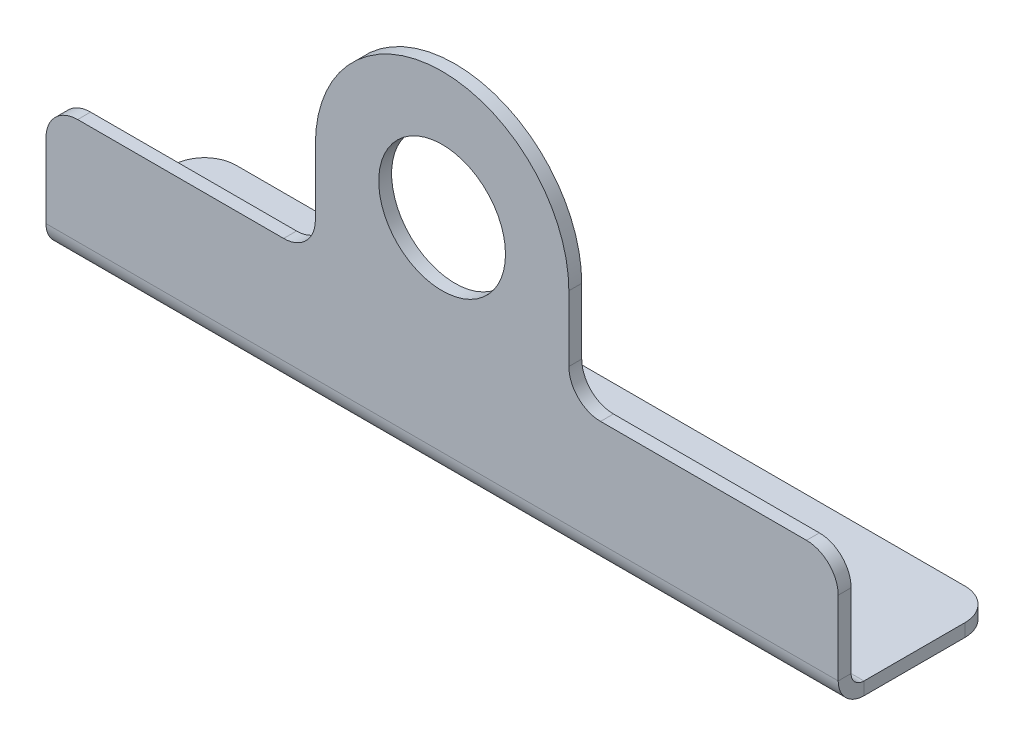
ISO-10303-21;
HEADER;
FILE_DESCRIPTION(('STEP AP214'),'2;1');
FILE_NAME('part.step','',(''),(''),'','','');
FILE_SCHEMA(('AUTOMOTIVE_DESIGN { 1 0 10303 214 1 1 1 1 }'));
ENDSEC;
DATA;
#1=APPLICATION_CONTEXT('core data for automotive mechanical design processes');
#2=APPLICATION_PROTOCOL_DEFINITION('international standard','automotive_design',2000,#1);
#3=PRODUCT_CONTEXT('',#1,'mechanical');
#4=PRODUCT('Part','Part','',(#3));
#5=PRODUCT_RELATED_PRODUCT_CATEGORY('part','',(#4));
#6=PRODUCT_DEFINITION_FORMATION('','',#4);
#7=PRODUCT_DEFINITION_CONTEXT('part definition',#1,'design');
#8=PRODUCT_DEFINITION('design','',#6,#7);
#9=PRODUCT_DEFINITION_SHAPE('','',#8);
#10=(LENGTH_UNIT() NAMED_UNIT(*) SI_UNIT(.MILLI.,.METRE.));
#11=(NAMED_UNIT(*) PLANE_ANGLE_UNIT() SI_UNIT($,.RADIAN.));
#12=(NAMED_UNIT(*) SI_UNIT($,.STERADIAN.) SOLID_ANGLE_UNIT());
#13=UNCERTAINTY_MEASURE_WITH_UNIT(LENGTH_MEASURE(1.E-05),#10,'distance_accuracy_value','');
#14=(GEOMETRIC_REPRESENTATION_CONTEXT(3) GLOBAL_UNCERTAINTY_ASSIGNED_CONTEXT((#13)) GLOBAL_UNIT_ASSIGNED_CONTEXT((#10,
#11,#12)) REPRESENTATION_CONTEXT('',''));
#15=CARTESIAN_POINT('',(0.,0.,0.));
#16=DIRECTION('',(0.,0.,1.));
#17=DIRECTION('',(1.,0.,0.));
#18=AXIS2_PLACEMENT_3D('',#15,#16,#17);
#19=CARTESIAN_POINT('',(-25.,5.49999999999999,-0.8128));
#20=DIRECTION('',(-1.,0.,0.));
#21=DIRECTION('',(0.,0.,1.));
#22=AXIS2_PLACEMENT_3D('',#19,#20,#21);
#23=PLANE('',#22);
#24=DIRECTION('',(0.,-1.,0.));
#25=VECTOR('',#24,1.);
#26=CARTESIAN_POINT('',(-25.,5.49999999999999,-0.8128));
#27=LINE('',#26,#25);
#28=CARTESIAN_POINT('',(-25.,5.49999999999999,-0.8128));
#29=VERTEX_POINT('',#28);
#30=CARTESIAN_POINT('',(-25.,0.812799999999997,-0.812799999999998));
#31=VERTEX_POINT('',#30);
#32=EDGE_CURVE('E259',#29,#31,#27,.T.);
#33=ORIENTED_EDGE('',*,*,#32,.T.);
#34=DIRECTION('',(0.,0.,1.));
#35=VECTOR('',#34,1.);
#36=CARTESIAN_POINT('',(-25.,0.812799999999997,-0.812799999999998));
#37=LINE('',#36,#35);
#38=CARTESIAN_POINT('',(-25.,0.812799999999999,0.));
#39=VERTEX_POINT('',#38);
#40=EDGE_CURVE('E211',#31,#39,#37,.T.);
#41=ORIENTED_EDGE('',*,*,#40,.T.);
#42=DIRECTION('',(0.,-1.,0.));
#43=VECTOR('',#42,1.);
#44=CARTESIAN_POINT('',(-25.,5.49999999999999,0.));
#45=LINE('',#44,#43);
#46=CARTESIAN_POINT('',(-25.,5.49999999999999,0.));
#47=VERTEX_POINT('',#46);
#48=EDGE_CURVE('E232',#47,#39,#45,.T.);
#49=ORIENTED_EDGE('',*,*,#48,.F.);
#50=DIRECTION('',(0.,0.,1.));
#51=VECTOR('',#50,1.);
#52=CARTESIAN_POINT('',(-25.,5.49999999999999,-0.8128));
#53=LINE('',#52,#51);
#54=EDGE_CURVE('E293',#29,#47,#53,.T.);
#55=ORIENTED_EDGE('',*,*,#54,.F.);
#56=EDGE_LOOP('',(#33,#41,#49,#55));
#57=FACE_BOUND('',#56,.T.);
#58=ADVANCED_FACE('F41',(#57),#23,.T.);
#59=CARTESIAN_POINT('',(23.,5.49999999999999,-0.8128));
#60=DIRECTION('',(0.,0.,1.));
#61=DIRECTION('',(1.,0.,0.));
#62=AXIS2_PLACEMENT_3D('',#59,#60,#61);
#63=PLANE('',#62);
#64=CARTESIAN_POINT('',(0.,13.64,-0.8128));
#65=DIRECTION('',(0.,0.,1.));
#66=DIRECTION('',(1.,0.,0.));
#67=AXIS2_PLACEMENT_3D('',#64,#65,#66);
#68=CIRCLE('',#67,4.);
#69=CARTESIAN_POINT('',(4.,13.64,-0.8128));
#70=VERTEX_POINT('',#69);
#71=EDGE_CURVE('E223',#70,#70,#68,.T.);
#72=ORIENTED_EDGE('',*,*,#71,.T.);
#73=EDGE_LOOP('',(#72));
#74=FACE_BOUND('',#73,.T.);
#75=DIRECTION('',(-1.,0.,0.));
#76=VECTOR('',#75,1.);
#77=CARTESIAN_POINT('',(-25.,0.812799999999997,-0.812799999999998));
#78=LINE('',#77,#76);
#79=CARTESIAN_POINT('',(25.,0.812800000000001,-0.812799999999998));
#80=VERTEX_POINT('',#79);
#81=EDGE_CURVE('E215',#31,#80,#78,.F.);
#82=ORIENTED_EDGE('',*,*,#81,.F.);
#83=ORIENTED_EDGE('',*,*,#32,.F.);
#84=CARTESIAN_POINT('',(-23.,5.49999999999999,-0.8128));
#85=DIRECTION('',(0.,0.,1.));
#86=DIRECTION('',(1.,0.,0.));
#87=AXIS2_PLACEMENT_3D('',#84,#85,#86);
#88=CIRCLE('',#87,2.);
#89=CARTESIAN_POINT('',(-23.,7.5,-0.8128));
#90=VERTEX_POINT('',#89);
#91=EDGE_CURVE('E256',#90,#29,#88,.T.);
#92=ORIENTED_EDGE('',*,*,#91,.F.);
#93=DIRECTION('',(-1.,0.,0.));
#94=VECTOR('',#93,1.);
#95=CARTESIAN_POINT('',(-10.,7.5,-0.8128));
#96=LINE('',#95,#94);
#97=CARTESIAN_POINT('',(-10.,7.5,-0.8128));
#98=VERTEX_POINT('',#97);
#99=EDGE_CURVE('E253',#98,#90,#96,.T.);
#100=ORIENTED_EDGE('',*,*,#99,.F.);
#101=CARTESIAN_POINT('',(-10.,9.5,-0.8128));
#102=DIRECTION('',(0.,0.,-1.));
#103=DIRECTION('',(-1.,0.,0.));
#104=AXIS2_PLACEMENT_3D('',#101,#102,#103);
#105=CIRCLE('',#104,2.);
#106=CARTESIAN_POINT('',(-8.,9.5,-0.8128));
#107=VERTEX_POINT('',#106);
#108=EDGE_CURVE('E250',#107,#98,#105,.T.);
#109=ORIENTED_EDGE('',*,*,#108,.F.);
#110=DIRECTION('',(0.,-1.,0.));
#111=VECTOR('',#110,1.);
#112=CARTESIAN_POINT('',(-8.,13.64,-0.8128));
#113=LINE('',#112,#111);
#114=CARTESIAN_POINT('',(-8.,13.64,-0.8128));
#115=VERTEX_POINT('',#114);
#116=EDGE_CURVE('E247',#115,#107,#113,.T.);
#117=ORIENTED_EDGE('',*,*,#116,.F.);
#118=CARTESIAN_POINT('',(0.,13.64,-0.8128));
#119=DIRECTION('',(0.,0.,1.));
#120=DIRECTION('',(1.,0.,0.));
#121=AXIS2_PLACEMENT_3D('',#118,#119,#120);
#122=CIRCLE('',#121,8.);
#123=CARTESIAN_POINT('',(8.,13.64,-0.8128));
#124=VERTEX_POINT('',#123);
#125=EDGE_CURVE('E244',#124,#115,#122,.T.);
#126=ORIENTED_EDGE('',*,*,#125,.F.);
#127=DIRECTION('',(0.,1.,0.));
#128=VECTOR('',#127,1.);
#129=CARTESIAN_POINT('',(8.,9.5,-0.8128));
#130=LINE('',#129,#128);
#131=CARTESIAN_POINT('',(8.,9.5,-0.8128));
#132=VERTEX_POINT('',#131);
#133=EDGE_CURVE('E241',#132,#124,#130,.T.);
#134=ORIENTED_EDGE('',*,*,#133,.F.);
#135=CARTESIAN_POINT('',(10.,9.5,-0.8128));
#136=DIRECTION('',(0.,0.,-1.));
#137=DIRECTION('',(-1.,0.,0.));
#138=AXIS2_PLACEMENT_3D('',#135,#136,#137);
#139=CIRCLE('',#138,2.);
#140=CARTESIAN_POINT('',(10.,7.5,-0.8128));
#141=VERTEX_POINT('',#140);
#142=EDGE_CURVE('E238',#141,#132,#139,.T.);
#143=ORIENTED_EDGE('',*,*,#142,.F.);
#144=DIRECTION('',(-1.,0.,0.));
#145=VECTOR('',#144,1.);
#146=CARTESIAN_POINT('',(23.,7.49999999999999,-0.8128));
#147=LINE('',#146,#145);
#148=CARTESIAN_POINT('',(23.,7.49999999999999,-0.8128));
#149=VERTEX_POINT('',#148);
#150=EDGE_CURVE('E235',#149,#141,#147,.T.);
#151=ORIENTED_EDGE('',*,*,#150,.F.);
#152=CARTESIAN_POINT('',(23.,5.49999999999999,-0.8128));
#153=DIRECTION('',(0.,0.,1.));
#154=DIRECTION('',(1.,0.,0.));
#155=AXIS2_PLACEMENT_3D('',#152,#153,#154);
#156=CIRCLE('',#155,2.);
#157=CARTESIAN_POINT('',(25.,5.49999999999999,-0.8128));
#158=VERTEX_POINT('',#157);
#159=EDGE_CURVE('E231',#158,#149,#156,.T.);
#160=ORIENTED_EDGE('',*,*,#159,.F.);
#161=DIRECTION('',(0.,1.,0.));
#162=VECTOR('',#161,1.);
#163=CARTESIAN_POINT('',(25.,0.,-0.8128));
#164=LINE('',#163,#162);
#165=EDGE_CURVE('E229',#80,#158,#164,.T.);
#166=ORIENTED_EDGE('',*,*,#165,.F.);
#167=EDGE_LOOP('',(#82,#83,#92,#100,#109,#117,#126,#134,#143,#151,#160,#166));
#168=FACE_BOUND('',#167,.T.);
#169=ADVANCED_FACE('F378',(#74,#168),#63,.F.);
#170=CARTESIAN_POINT('',(23.,5.49999999999999,0.));
#171=DIRECTION('',(0.,0.,1.));
#172=DIRECTION('',(1.,0.,0.));
#173=AXIS2_PLACEMENT_3D('',#170,#171,#172);
#174=PLANE('',#173);
#175=CARTESIAN_POINT('',(0.,13.64,0.));
#176=DIRECTION('',(0.,0.,1.));
#177=DIRECTION('',(1.,0.,0.));
#178=AXIS2_PLACEMENT_3D('',#175,#176,#177);
#179=CIRCLE('',#178,4.);
#180=CARTESIAN_POINT('',(4.,13.64,0.));
#181=VERTEX_POINT('',#180);
#182=EDGE_CURVE('E221',#181,#181,#179,.T.);
#183=ORIENTED_EDGE('',*,*,#182,.F.);
#184=EDGE_LOOP('',(#183));
#185=FACE_BOUND('',#184,.T.);
#186=ORIENTED_EDGE('',*,*,#48,.T.);
#187=DIRECTION('',(-1.,0.,0.));
#188=VECTOR('',#187,1.);
#189=CARTESIAN_POINT('',(-25.,0.812799999999999,0.));
#190=LINE('',#189,#188);
#191=CARTESIAN_POINT('',(25.,0.812800000000001,0.));
#192=VERTEX_POINT('',#191);
#193=EDGE_CURVE('E175',#39,#192,#190,.F.);
#194=ORIENTED_EDGE('',*,*,#193,.T.);
#195=DIRECTION('',(0.,1.,0.));
#196=VECTOR('',#195,1.);
#197=CARTESIAN_POINT('',(25.,0.,0.));
#198=LINE('',#197,#196);
#199=CARTESIAN_POINT('',(25.,5.49999999999999,0.));
#200=VERTEX_POINT('',#199);
#201=EDGE_CURVE('E226',#192,#200,#198,.T.);
#202=ORIENTED_EDGE('',*,*,#201,.T.);
#203=CARTESIAN_POINT('',(23.,5.49999999999999,0.));
#204=DIRECTION('',(0.,0.,1.));
#205=DIRECTION('',(1.,0.,0.));
#206=AXIS2_PLACEMENT_3D('',#203,#204,#205);
#207=CIRCLE('',#206,2.);
#208=CARTESIAN_POINT('',(23.,7.49999999999999,0.));
#209=VERTEX_POINT('',#208);
#210=EDGE_CURVE('E264',#200,#209,#207,.T.);
#211=ORIENTED_EDGE('',*,*,#210,.T.);
#212=DIRECTION('',(-1.,0.,0.));
#213=VECTOR('',#212,1.);
#214=CARTESIAN_POINT('',(23.,7.49999999999999,0.));
#215=LINE('',#214,#213);
#216=CARTESIAN_POINT('',(10.,7.5,0.));
#217=VERTEX_POINT('',#216);
#218=EDGE_CURVE('E267',#209,#217,#215,.T.);
#219=ORIENTED_EDGE('',*,*,#218,.T.);
#220=CARTESIAN_POINT('',(10.,9.5,0.));
#221=DIRECTION('',(0.,0.,-1.));
#222=DIRECTION('',(-1.,0.,0.));
#223=AXIS2_PLACEMENT_3D('',#220,#221,#222);
#224=CIRCLE('',#223,2.);
#225=CARTESIAN_POINT('',(8.,9.5,0.));
#226=VERTEX_POINT('',#225);
#227=EDGE_CURVE('E270',#217,#226,#224,.T.);
#228=ORIENTED_EDGE('',*,*,#227,.T.);
#229=DIRECTION('',(0.,1.,0.));
#230=VECTOR('',#229,1.);
#231=CARTESIAN_POINT('',(8.,9.5,0.));
#232=LINE('',#231,#230);
#233=CARTESIAN_POINT('',(8.,13.64,0.));
#234=VERTEX_POINT('',#233);
#235=EDGE_CURVE('E273',#226,#234,#232,.T.);
#236=ORIENTED_EDGE('',*,*,#235,.T.);
#237=CARTESIAN_POINT('',(0.,13.64,0.));
#238=DIRECTION('',(0.,0.,1.));
#239=DIRECTION('',(1.,0.,0.));
#240=AXIS2_PLACEMENT_3D('',#237,#238,#239);
#241=CIRCLE('',#240,8.);
#242=CARTESIAN_POINT('',(-8.,13.64,0.));
#243=VERTEX_POINT('',#242);
#244=EDGE_CURVE('E276',#234,#243,#241,.T.);
#245=ORIENTED_EDGE('',*,*,#244,.T.);
#246=DIRECTION('',(0.,-1.,0.));
#247=VECTOR('',#246,1.);
#248=CARTESIAN_POINT('',(-8.,13.64,0.));
#249=LINE('',#248,#247);
#250=CARTESIAN_POINT('',(-8.,9.5,0.));
#251=VERTEX_POINT('',#250);
#252=EDGE_CURVE('E279',#243,#251,#249,.T.);
#253=ORIENTED_EDGE('',*,*,#252,.T.);
#254=CARTESIAN_POINT('',(-10.,9.5,0.));
#255=DIRECTION('',(0.,0.,-1.));
#256=DIRECTION('',(-1.,0.,0.));
#257=AXIS2_PLACEMENT_3D('',#254,#255,#256);
#258=CIRCLE('',#257,2.);
#259=CARTESIAN_POINT('',(-10.,7.5,0.));
#260=VERTEX_POINT('',#259);
#261=EDGE_CURVE('E282',#251,#260,#258,.T.);
#262=ORIENTED_EDGE('',*,*,#261,.T.);
#263=DIRECTION('',(-1.,0.,0.));
#264=VECTOR('',#263,1.);
#265=CARTESIAN_POINT('',(-10.,7.5,0.));
#266=LINE('',#265,#264);
#267=CARTESIAN_POINT('',(-23.,7.5,0.));
#268=VERTEX_POINT('',#267);
#269=EDGE_CURVE('E285',#260,#268,#266,.T.);
#270=ORIENTED_EDGE('',*,*,#269,.T.);
#271=CARTESIAN_POINT('',(-23.,5.49999999999999,0.));
#272=DIRECTION('',(0.,0.,1.));
#273=DIRECTION('',(1.,0.,0.));
#274=AXIS2_PLACEMENT_3D('',#271,#272,#273);
#275=CIRCLE('',#274,2.);
#276=EDGE_CURVE('E288',#268,#47,#275,.T.);
#277=ORIENTED_EDGE('',*,*,#276,.T.);
#278=EDGE_LOOP('',(#186,#194,#202,#211,#219,#228,#236,#245,#253,#262,#270,#277));
#279=FACE_BOUND('',#278,.T.);
#280=ADVANCED_FACE('F385',(#185,#279),#174,.T.);
#281=CARTESIAN_POINT('',(25.,0.,-0.8128));
#282=DIRECTION('',(1.,0.,0.));
#283=DIRECTION('',(0.,0.,-1.));
#284=AXIS2_PLACEMENT_3D('',#281,#282,#283);
#285=PLANE('',#284);
#286=DIRECTION('',(0.,0.,1.));
#287=VECTOR('',#286,1.);
#288=CARTESIAN_POINT('',(25.,0.812800000000001,-0.812799999999998));
#289=LINE('',#288,#287);
#290=EDGE_CURVE('E218',#80,#192,#289,.T.);
#291=ORIENTED_EDGE('',*,*,#290,.F.);
#292=ORIENTED_EDGE('',*,*,#165,.T.);
#293=DIRECTION('',(0.,0.,1.));
#294=VECTOR('',#293,1.);
#295=CARTESIAN_POINT('',(25.,5.49999999999999,-0.8128));
#296=LINE('',#295,#294);
#297=EDGE_CURVE('E262',#158,#200,#296,.T.);
#298=ORIENTED_EDGE('',*,*,#297,.T.);
#299=ORIENTED_EDGE('',*,*,#201,.F.);
#300=EDGE_LOOP('',(#291,#292,#298,#299));
#301=FACE_BOUND('',#300,.T.);
#302=ADVANCED_FACE('F394',(#301),#285,.T.);
#303=CARTESIAN_POINT('',(-23.,5.49999999999999,-0.8128));
#304=DIRECTION('',(0.,0.,1.));
#305=DIRECTION('',(1.,0.,0.));
#306=AXIS2_PLACEMENT_3D('',#303,#304,#305);
#307=CYLINDRICAL_SURFACE('',#306,2.);
#308=ORIENTED_EDGE('',*,*,#276,.F.);
#309=DIRECTION('',(0.,0.,1.));
#310=VECTOR('',#309,1.);
#311=CARTESIAN_POINT('',(-23.,7.5,-0.8128));
#312=LINE('',#311,#310);
#313=EDGE_CURVE('E296',#90,#268,#312,.T.);
#314=ORIENTED_EDGE('',*,*,#313,.F.);
#315=ORIENTED_EDGE('',*,*,#91,.T.);
#316=ORIENTED_EDGE('',*,*,#54,.T.);
#317=EDGE_LOOP('',(#308,#314,#315,#316));
#318=FACE_BOUND('',#317,.T.);
#319=ADVANCED_FACE('F390',(#318),#307,.T.);
#320=CARTESIAN_POINT('',(-10.,7.5,-0.8128));
#321=DIRECTION('',(0.,1.,0.));
#322=DIRECTION('',(-1.,0.,0.));
#323=AXIS2_PLACEMENT_3D('',#320,#321,#322);
#324=PLANE('',#323);
#325=ORIENTED_EDGE('',*,*,#269,.F.);
#326=DIRECTION('',(0.,0.,1.));
#327=VECTOR('',#326,1.);
#328=CARTESIAN_POINT('',(-10.,7.5,-0.8128));
#329=LINE('',#328,#327);
#330=EDGE_CURVE('E298',#98,#260,#329,.T.);
#331=ORIENTED_EDGE('',*,*,#330,.F.);
#332=ORIENTED_EDGE('',*,*,#99,.T.);
#333=ORIENTED_EDGE('',*,*,#313,.T.);
#334=EDGE_LOOP('',(#325,#331,#332,#333));
#335=FACE_BOUND('',#334,.T.);
#336=ADVANCED_FACE('F393',(#335),#324,.T.);
#337=CARTESIAN_POINT('',(-10.,9.5,-0.8128));
#338=DIRECTION('',(0.,0.,1.));
#339=DIRECTION('',(1.,0.,0.));
#340=AXIS2_PLACEMENT_3D('',#337,#338,#339);
#341=CYLINDRICAL_SURFACE('',#340,2.);
#342=ORIENTED_EDGE('',*,*,#261,.F.);
#343=DIRECTION('',(0.,0.,1.));
#344=VECTOR('',#343,1.);
#345=CARTESIAN_POINT('',(-8.,9.5,-0.8128));
#346=LINE('',#345,#344);
#347=EDGE_CURVE('E300',#107,#251,#346,.T.);
#348=ORIENTED_EDGE('',*,*,#347,.F.);
#349=ORIENTED_EDGE('',*,*,#108,.T.);
#350=ORIENTED_EDGE('',*,*,#330,.T.);
#351=EDGE_LOOP('',(#342,#348,#349,#350));
#352=FACE_BOUND('',#351,.T.);
#353=ADVANCED_FACE('F398',(#352),#341,.F.);
#354=CARTESIAN_POINT('',(-8.,13.64,-0.8128));
#355=DIRECTION('',(-1.,0.,0.));
#356=DIRECTION('',(0.,-1.,0.));
#357=AXIS2_PLACEMENT_3D('',#354,#355,#356);
#358=PLANE('',#357);
#359=ORIENTED_EDGE('',*,*,#252,.F.);
#360=DIRECTION('',(0.,0.,1.));
#361=VECTOR('',#360,1.);
#362=CARTESIAN_POINT('',(-8.,13.64,-0.8128));
#363=LINE('',#362,#361);
#364=EDGE_CURVE('E302',#115,#243,#363,.T.);
#365=ORIENTED_EDGE('',*,*,#364,.F.);
#366=ORIENTED_EDGE('',*,*,#116,.T.);
#367=ORIENTED_EDGE('',*,*,#347,.T.);
#368=EDGE_LOOP('',(#359,#365,#366,#367));
#369=FACE_BOUND('',#368,.T.);
#370=ADVANCED_FACE('F402',(#369),#358,.T.);
#371=CARTESIAN_POINT('',(0.,13.64,-0.8128));
#372=DIRECTION('',(0.,0.,1.));
#373=DIRECTION('',(1.,0.,0.));
#374=AXIS2_PLACEMENT_3D('',#371,#372,#373);
#375=CYLINDRICAL_SURFACE('',#374,8.);
#376=ORIENTED_EDGE('',*,*,#244,.F.);
#377=DIRECTION('',(0.,0.,1.));
#378=VECTOR('',#377,1.);
#379=CARTESIAN_POINT('',(8.,13.64,-0.8128));
#380=LINE('',#379,#378);
#381=EDGE_CURVE('E304',#124,#234,#380,.T.);
#382=ORIENTED_EDGE('',*,*,#381,.F.);
#383=ORIENTED_EDGE('',*,*,#125,.T.);
#384=ORIENTED_EDGE('',*,*,#364,.T.);
#385=EDGE_LOOP('',(#376,#382,#383,#384));
#386=FACE_BOUND('',#385,.T.);
#387=ADVANCED_FACE('F406',(#386),#375,.T.);
#388=CARTESIAN_POINT('',(8.,9.5,-0.8128));
#389=DIRECTION('',(1.,0.,0.));
#390=DIRECTION('',(0.,1.,0.));
#391=AXIS2_PLACEMENT_3D('',#388,#389,#390);
#392=PLANE('',#391);
#393=ORIENTED_EDGE('',*,*,#235,.F.);
#394=DIRECTION('',(0.,0.,1.));
#395=VECTOR('',#394,1.);
#396=CARTESIAN_POINT('',(8.,9.5,-0.8128));
#397=LINE('',#396,#395);
#398=EDGE_CURVE('E306',#132,#226,#397,.T.);
#399=ORIENTED_EDGE('',*,*,#398,.F.);
#400=ORIENTED_EDGE('',*,*,#133,.T.);
#401=ORIENTED_EDGE('',*,*,#381,.T.);
#402=EDGE_LOOP('',(#393,#399,#400,#401));
#403=FACE_BOUND('',#402,.T.);
#404=ADVANCED_FACE('F410',(#403),#392,.T.);
#405=CARTESIAN_POINT('',(10.,9.5,-0.8128));
#406=DIRECTION('',(0.,0.,1.));
#407=DIRECTION('',(1.,0.,0.));
#408=AXIS2_PLACEMENT_3D('',#405,#406,#407);
#409=CYLINDRICAL_SURFACE('',#408,2.);
#410=ORIENTED_EDGE('',*,*,#227,.F.);
#411=DIRECTION('',(0.,0.,1.));
#412=VECTOR('',#411,1.);
#413=CARTESIAN_POINT('',(10.,7.5,-0.8128));
#414=LINE('',#413,#412);
#415=EDGE_CURVE('E308',#141,#217,#414,.T.);
#416=ORIENTED_EDGE('',*,*,#415,.F.);
#417=ORIENTED_EDGE('',*,*,#142,.T.);
#418=ORIENTED_EDGE('',*,*,#398,.T.);
#419=EDGE_LOOP('',(#410,#416,#417,#418));
#420=FACE_BOUND('',#419,.T.);
#421=ADVANCED_FACE('F414',(#420),#409,.F.);
#422=CARTESIAN_POINT('',(23.,7.49999999999999,-0.8128));
#423=DIRECTION('',(0.,1.,0.));
#424=DIRECTION('',(-1.,0.,0.));
#425=AXIS2_PLACEMENT_3D('',#422,#423,#424);
#426=PLANE('',#425);
#427=ORIENTED_EDGE('',*,*,#218,.F.);
#428=DIRECTION('',(0.,0.,1.));
#429=VECTOR('',#428,1.);
#430=CARTESIAN_POINT('',(23.,7.49999999999999,-0.8128));
#431=LINE('',#430,#429);
#432=EDGE_CURVE('E310',#149,#209,#431,.T.);
#433=ORIENTED_EDGE('',*,*,#432,.F.);
#434=ORIENTED_EDGE('',*,*,#150,.T.);
#435=ORIENTED_EDGE('',*,*,#415,.T.);
#436=EDGE_LOOP('',(#427,#433,#434,#435));
#437=FACE_BOUND('',#436,.T.);
#438=ADVANCED_FACE('F418',(#437),#426,.T.);
#439=CARTESIAN_POINT('',(23.,5.49999999999999,-0.8128));
#440=DIRECTION('',(0.,0.,1.));
#441=DIRECTION('',(1.,0.,0.));
#442=AXIS2_PLACEMENT_3D('',#439,#440,#441);
#443=CYLINDRICAL_SURFACE('',#442,2.);
#444=ORIENTED_EDGE('',*,*,#210,.F.);
#445=ORIENTED_EDGE('',*,*,#297,.F.);
#446=ORIENTED_EDGE('',*,*,#159,.T.);
#447=ORIENTED_EDGE('',*,*,#432,.T.);
#448=EDGE_LOOP('',(#444,#445,#446,#447));
#449=FACE_BOUND('',#448,.T.);
#450=ADVANCED_FACE('F422',(#449),#443,.T.);
#451=CARTESIAN_POINT('',(0.,13.64,-0.8128));
#452=DIRECTION('',(0.,0.,1.));
#453=DIRECTION('',(1.,0.,0.));
#454=AXIS2_PLACEMENT_3D('',#451,#452,#453);
#455=CYLINDRICAL_SURFACE('',#454,4.);
#456=ORIENTED_EDGE('',*,*,#71,.F.);
#457=EDGE_LOOP('',(#456));
#458=FACE_BOUND('',#457,.T.);
#459=ORIENTED_EDGE('',*,*,#182,.T.);
#460=EDGE_LOOP('',(#459));
#461=FACE_BOUND('',#460,.T.);
#462=ADVANCED_FACE('F426',(#458,#461),#455,.F.);
#463=CARTESIAN_POINT('',(25.,0.812799999999999,-1.6256));
#464=DIRECTION('',(1.,0.,0.));
#465=DIRECTION('',(0.,1.,0.));
#466=AXIS2_PLACEMENT_3D('',#463,#464,#465);
#467=PLANE('',#466);
#468=DIRECTION('',(0.,-1.,0.));
#469=VECTOR('',#468,1.);
#470=CARTESIAN_POINT('',(25.,0.,-1.6256));
#471=LINE('',#470,#469);
#472=CARTESIAN_POINT('',(25.,0.,-1.6256));
#473=VERTEX_POINT('',#472);
#474=CARTESIAN_POINT('',(25.,-0.812800000000003,-1.62559999999999));
#475=VERTEX_POINT('',#474);
#476=EDGE_CURVE('E333',#473,#475,#471,.T.);
#477=ORIENTED_EDGE('',*,*,#476,.F.);
#478=CARTESIAN_POINT('',(25.,0.812799999999999,-1.6256));
#479=DIRECTION('',(-1.,0.,0.));
#480=DIRECTION('',(0.,-1.,0.));
#481=AXIS2_PLACEMENT_3D('',#478,#479,#480);
#482=CIRCLE('',#481,0.812800000000002);
#483=EDGE_CURVE('E178',#80,#473,#482,.F.);
#484=ORIENTED_EDGE('',*,*,#483,.F.);
#485=ORIENTED_EDGE('',*,*,#290,.T.);
#486=CARTESIAN_POINT('',(25.,0.812799999999999,-1.6256));
#487=DIRECTION('',(-1.,0.,0.));
#488=DIRECTION('',(0.,-1.,0.));
#489=AXIS2_PLACEMENT_3D('',#486,#487,#488);
#490=CIRCLE('',#489,1.6256);
#491=EDGE_CURVE('E210',#192,#475,#490,.F.);
#492=ORIENTED_EDGE('',*,*,#491,.T.);
#493=EDGE_LOOP('',(#477,#484,#485,#492));
#494=FACE_BOUND('',#493,.T.);
#495=ADVANCED_FACE('F447',(#494),#467,.T.);
#496=CARTESIAN_POINT('',(-25.,0.812799999999996,-1.6256));
#497=DIRECTION('',(1.,0.,0.));
#498=DIRECTION('',(0.,1.,0.));
#499=AXIS2_PLACEMENT_3D('',#496,#497,#498);
#500=PLANE('',#499);
#501=CARTESIAN_POINT('',(-25.,0.812799999999996,-1.6256));
#502=DIRECTION('',(-1.,0.,0.));
#503=DIRECTION('',(0.,-1.,0.));
#504=AXIS2_PLACEMENT_3D('',#501,#502,#503);
#505=CIRCLE('',#504,0.812800000000002);
#506=CARTESIAN_POINT('',(-25.,0.,-1.6256));
#507=VERTEX_POINT('',#506);
#508=EDGE_CURVE('E185',#507,#31,#505,.T.);
#509=ORIENTED_EDGE('',*,*,#508,.F.);
#510=DIRECTION('',(0.,-1.,0.));
#511=VECTOR('',#510,1.);
#512=CARTESIAN_POINT('',(-25.,0.,-1.6256));
#513=LINE('',#512,#511);
#514=CARTESIAN_POINT('',(-25.,-0.812800000000003,-1.62559999999999));
#515=VERTEX_POINT('',#514);
#516=EDGE_CURVE('E182',#507,#515,#513,.T.);
#517=ORIENTED_EDGE('',*,*,#516,.T.);
#518=CARTESIAN_POINT('',(-25.,0.812799999999996,-1.6256));
#519=DIRECTION('',(-1.,0.,0.));
#520=DIRECTION('',(0.,-1.,0.));
#521=AXIS2_PLACEMENT_3D('',#518,#519,#520);
#522=CIRCLE('',#521,1.6256);
#523=EDGE_CURVE('E168',#515,#39,#522,.T.);
#524=ORIENTED_EDGE('',*,*,#523,.T.);
#525=ORIENTED_EDGE('',*,*,#40,.F.);
#526=EDGE_LOOP('',(#509,#517,#524,#525));
#527=FACE_BOUND('',#526,.T.);
#528=ADVANCED_FACE('F183',(#527),#500,.F.);
#529=CARTESIAN_POINT('',(-25.,0.812799999999996,-1.6256));
#530=DIRECTION('',(-1.,0.,0.));
#531=DIRECTION('',(0.,-1.,0.));
#532=AXIS2_PLACEMENT_3D('',#529,#530,#531);
#533=CYLINDRICAL_SURFACE('',#532,1.6256);
#534=ORIENTED_EDGE('',*,*,#193,.F.);
#535=ORIENTED_EDGE('',*,*,#523,.F.);
#536=DIRECTION('',(1.,0.,0.));
#537=VECTOR('',#536,1.);
#538=CARTESIAN_POINT('',(0.,-0.812800000000003,-1.62559999999999));
#539=LINE('',#538,#537);
#540=EDGE_CURVE('E172',#515,#475,#539,.T.);
#541=ORIENTED_EDGE('',*,*,#540,.T.);
#542=ORIENTED_EDGE('',*,*,#491,.F.);
#543=EDGE_LOOP('',(#534,#535,#541,#542));
#544=FACE_BOUND('',#543,.T.);
#545=ADVANCED_FACE('F170',(#544),#533,.T.);
#546=CARTESIAN_POINT('',(-25.,0.812799999999996,-1.6256));
#547=DIRECTION('',(-1.,0.,0.));
#548=DIRECTION('',(0.,-1.,0.));
#549=AXIS2_PLACEMENT_3D('',#546,#547,#548);
#550=CYLINDRICAL_SURFACE('',#549,0.812800000000002);
#551=ORIENTED_EDGE('',*,*,#81,.T.);
#552=ORIENTED_EDGE('',*,*,#483,.T.);
#553=DIRECTION('',(-1.,0.,0.));
#554=VECTOR('',#553,1.);
#555=CARTESIAN_POINT('',(25.,0.,-1.6256));
#556=LINE('',#555,#554);
#557=EDGE_CURVE('E187',#473,#507,#556,.T.);
#558=ORIENTED_EDGE('',*,*,#557,.T.);
#559=ORIENTED_EDGE('',*,*,#508,.T.);
#560=EDGE_LOOP('',(#551,#552,#558,#559));
#561=FACE_BOUND('',#560,.T.);
#562=ADVANCED_FACE('F442',(#561),#550,.F.);
#563=CARTESIAN_POINT('',(-25.,-0.812800000000032,-10.));
#564=DIRECTION('',(1.,0.,0.));
#565=DIRECTION('',(0.,0.,-1.));
#566=AXIS2_PLACEMENT_3D('',#563,#564,#565);
#567=PLANE('',#566);
#568=DIRECTION('',(0.,0.,-1.));
#569=VECTOR('',#568,1.);
#570=CARTESIAN_POINT('',(-25.,0.,-10.));
#571=LINE('',#570,#569);
#572=CARTESIAN_POINT('',(-25.,0.,-8.));
#573=VERTEX_POINT('',#572);
#574=EDGE_CURVE('E195',#507,#573,#571,.T.);
#575=ORIENTED_EDGE('',*,*,#574,.T.);
#576=DIRECTION('',(0.,1.,0.));
#577=VECTOR('',#576,1.);
#578=CARTESIAN_POINT('',(-25.,-0.812800000000025,-8.));
#579=LINE('',#578,#577);
#580=CARTESIAN_POINT('',(-25.,-0.812800000000025,-8.));
#581=VERTEX_POINT('',#580);
#582=EDGE_CURVE('E11',#573,#581,#579,.F.);
#583=ORIENTED_EDGE('',*,*,#582,.T.);
#584=DIRECTION('',(0.,0.,-1.));
#585=VECTOR('',#584,1.);
#586=CARTESIAN_POINT('',(-25.,-0.812800000000032,-10.));
#587=LINE('',#586,#585);
#588=EDGE_CURVE('E191',#515,#581,#587,.T.);
#589=ORIENTED_EDGE('',*,*,#588,.F.);
#590=ORIENTED_EDGE('',*,*,#516,.F.);
#591=EDGE_LOOP('',(#575,#583,#589,#590));
#592=FACE_BOUND('',#591,.T.);
#593=ADVANCED_FACE('F197',(#592),#567,.F.);
#594=CARTESIAN_POINT('',(25.,-0.8128,-0.812799999999997));
#595=DIRECTION('',(-1.,0.,0.));
#596=DIRECTION('',(0.,0.,1.));
#597=AXIS2_PLACEMENT_3D('',#594,#595,#596);
#598=PLANE('',#597);
#599=DIRECTION('',(0.,0.,1.));
#600=VECTOR('',#599,1.);
#601=CARTESIAN_POINT('',(25.,-0.8128,-0.812799999999997));
#602=LINE('',#601,#600);
#603=CARTESIAN_POINT('',(25.,-0.812800000000025,-8.));
#604=VERTEX_POINT('',#603);
#605=EDGE_CURVE('E194',#604,#475,#602,.T.);
#606=ORIENTED_EDGE('',*,*,#605,.F.);
#607=DIRECTION('',(0.,1.,0.));
#608=VECTOR('',#607,1.);
#609=CARTESIAN_POINT('',(25.,-0.812800000000025,-8.));
#610=LINE('',#609,#608);
#611=CARTESIAN_POINT('',(25.,0.,-8.00000000000001));
#612=VERTEX_POINT('',#611);
#613=EDGE_CURVE('E295',#604,#612,#610,.T.);
#614=ORIENTED_EDGE('',*,*,#613,.T.);
#615=DIRECTION('',(0.,0.,1.));
#616=VECTOR('',#615,1.);
#617=CARTESIAN_POINT('',(25.,0.,-0.8128));
#618=LINE('',#617,#616);
#619=EDGE_CURVE('E199',#612,#473,#618,.T.);
#620=ORIENTED_EDGE('',*,*,#619,.T.);
#621=ORIENTED_EDGE('',*,*,#476,.T.);
#622=EDGE_LOOP('',(#606,#614,#620,#621));
#623=FACE_BOUND('',#622,.T.);
#624=ADVANCED_FACE('F330',(#623),#598,.F.);
#625=CARTESIAN_POINT('',(0.,-0.812799999999997,0.));
#626=DIRECTION('',(0.,1.,0.));
#627=DIRECTION('',(0.,0.,1.));
#628=AXIS2_PLACEMENT_3D('',#625,#626,#627);
#629=PLANE('',#628);
#630=CARTESIAN_POINT('',(12.5,-0.812800000000089,-5.8128));
#631=DIRECTION('',(0.,1.,0.));
#632=DIRECTION('',(0.,0.,1.));
#633=AXIS2_PLACEMENT_3D('',#630,#631,#632);
#634=CIRCLE('',#633,2.5);
#635=CARTESIAN_POINT('',(12.5,-0.81280000000008,-3.3128));
#636=VERTEX_POINT('',#635);
#637=EDGE_CURVE('E351',#636,#636,#634,.T.);
#638=ORIENTED_EDGE('',*,*,#637,.T.);
#639=EDGE_LOOP('',(#638));
#640=FACE_BOUND('',#639,.T.);
#641=CARTESIAN_POINT('',(-12.5,-0.812800000000093,-5.8128));
#642=DIRECTION('',(0.,1.,0.));
#643=DIRECTION('',(0.,0.,1.));
#644=AXIS2_PLACEMENT_3D('',#641,#642,#643);
#645=CIRCLE('',#644,2.5);
#646=CARTESIAN_POINT('',(-12.5,-0.812800000000085,-3.3128));
#647=VERTEX_POINT('',#646);
#648=EDGE_CURVE('E344',#647,#647,#645,.T.);
#649=ORIENTED_EDGE('',*,*,#648,.T.);
#650=EDGE_LOOP('',(#649));
#651=FACE_BOUND('',#650,.T.);
#652=DIRECTION('',(1.,0.,0.));
#653=VECTOR('',#652,1.);
#654=CARTESIAN_POINT('',(25.,-0.812800000000032,-10.));
#655=LINE('',#654,#653);
#656=CARTESIAN_POINT('',(-23.,-0.812800000000032,-10.));
#657=VERTEX_POINT('',#656);
#658=CARTESIAN_POINT('',(23.,-0.812800000000032,-10.));
#659=VERTEX_POINT('',#658);
#660=EDGE_CURVE('E198',#657,#659,#655,.T.);
#661=ORIENTED_EDGE('',*,*,#660,.T.);
#662=CARTESIAN_POINT('',(23.,-0.812800000000025,-8.));
#663=DIRECTION('',(0.,1.,0.));
#664=DIRECTION('',(0.,0.,1.));
#665=AXIS2_PLACEMENT_3D('',#662,#663,#664);
#666=CIRCLE('',#665,2.);
#667=EDGE_CURVE('E49',#659,#604,#666,.F.);
#668=ORIENTED_EDGE('',*,*,#667,.T.);
#669=ORIENTED_EDGE('',*,*,#605,.T.);
#670=ORIENTED_EDGE('',*,*,#540,.F.);
#671=ORIENTED_EDGE('',*,*,#588,.T.);
#672=CARTESIAN_POINT('',(-23.,-0.812800000000025,-8.));
#673=DIRECTION('',(0.,1.,0.));
#674=DIRECTION('',(0.,0.,1.));
#675=AXIS2_PLACEMENT_3D('',#672,#673,#674);
#676=CIRCLE('',#675,2.);
#677=EDGE_CURVE('E324',#581,#657,#676,.F.);
#678=ORIENTED_EDGE('',*,*,#677,.T.);
#679=EDGE_LOOP('',(#661,#668,#669,#670,#671,#678));
#680=FACE_BOUND('',#679,.T.);
#681=ADVANCED_FACE('F190',(#640,#651,#680),#629,.F.);
#682=CARTESIAN_POINT('',(0.,0.,0.));
#683=DIRECTION('',(0.,1.,0.));
#684=DIRECTION('',(0.,0.,1.));
#685=AXIS2_PLACEMENT_3D('',#682,#683,#684);
#686=PLANE('',#685);
#687=CARTESIAN_POINT('',(12.5,0.,-5.8128));
#688=DIRECTION('',(0.,1.,0.));
#689=DIRECTION('',(0.,0.,1.));
#690=AXIS2_PLACEMENT_3D('',#687,#688,#689);
#691=CIRCLE('',#690,2.5);
#692=CARTESIAN_POINT('',(12.5,0.,-3.3128));
#693=VERTEX_POINT('',#692);
#694=EDGE_CURVE('E354',#693,#693,#691,.T.);
#695=ORIENTED_EDGE('',*,*,#694,.F.);
#696=EDGE_LOOP('',(#695));
#697=FACE_BOUND('',#696,.T.);
#698=CARTESIAN_POINT('',(-12.5,0.,-5.8128));
#699=DIRECTION('',(0.,1.,0.));
#700=DIRECTION('',(0.,0.,1.));
#701=AXIS2_PLACEMENT_3D('',#698,#699,#700);
#702=CIRCLE('',#701,2.5);
#703=CARTESIAN_POINT('',(-12.5,0.,-3.3128));
#704=VERTEX_POINT('',#703);
#705=EDGE_CURVE('E348',#704,#704,#702,.T.);
#706=ORIENTED_EDGE('',*,*,#705,.F.);
#707=EDGE_LOOP('',(#706));
#708=FACE_BOUND('',#707,.T.);
#709=ORIENTED_EDGE('',*,*,#619,.F.);
#710=CARTESIAN_POINT('',(23.,0.,-8.00000000000001));
#711=DIRECTION('',(0.,1.,0.));
#712=DIRECTION('',(0.,0.,1.));
#713=AXIS2_PLACEMENT_3D('',#710,#711,#712);
#714=CIRCLE('',#713,2.);
#715=CARTESIAN_POINT('',(23.,0.,-10.));
#716=VERTEX_POINT('',#715);
#717=EDGE_CURVE('E318',#612,#716,#714,.T.);
#718=ORIENTED_EDGE('',*,*,#717,.T.);
#719=DIRECTION('',(1.,0.,0.));
#720=VECTOR('',#719,1.);
#721=CARTESIAN_POINT('',(25.,0.,-10.));
#722=LINE('',#721,#720);
#723=CARTESIAN_POINT('',(-23.,0.,-10.));
#724=VERTEX_POINT('',#723);
#725=EDGE_CURVE('E202',#724,#716,#722,.T.);
#726=ORIENTED_EDGE('',*,*,#725,.F.);
#727=CARTESIAN_POINT('',(-23.,0.,-8.));
#728=DIRECTION('',(0.,1.,0.));
#729=DIRECTION('',(0.,0.,1.));
#730=AXIS2_PLACEMENT_3D('',#727,#728,#729);
#731=CIRCLE('',#730,2.);
#732=EDGE_CURVE('E316',#724,#573,#731,.T.);
#733=ORIENTED_EDGE('',*,*,#732,.T.);
#734=ORIENTED_EDGE('',*,*,#574,.F.);
#735=ORIENTED_EDGE('',*,*,#557,.F.);
#736=EDGE_LOOP('',(#709,#718,#726,#733,#734,#735));
#737=FACE_BOUND('',#736,.T.);
#738=ADVANCED_FACE('F337',(#697,#708,#737),#686,.T.);
#739=CARTESIAN_POINT('',(25.,-0.812800000000032,-10.));
#740=DIRECTION('',(0.,0.,1.));
#741=DIRECTION('',(0.,-1.,0.));
#742=AXIS2_PLACEMENT_3D('',#739,#740,#741);
#743=PLANE('',#742);
#744=ORIENTED_EDGE('',*,*,#725,.T.);
#745=DIRECTION('',(0.,1.,0.));
#746=VECTOR('',#745,1.);
#747=CARTESIAN_POINT('',(23.,-0.812800000000032,-10.));
#748=LINE('',#747,#746);
#749=EDGE_CURVE('E62',#716,#659,#748,.F.);
#750=ORIENTED_EDGE('',*,*,#749,.T.);
#751=ORIENTED_EDGE('',*,*,#660,.F.);
#752=DIRECTION('',(0.,1.,0.));
#753=VECTOR('',#752,1.);
#754=CARTESIAN_POINT('',(-23.,-0.812800000000032,-10.));
#755=LINE('',#754,#753);
#756=EDGE_CURVE('E320',#657,#724,#755,.T.);
#757=ORIENTED_EDGE('',*,*,#756,.T.);
#758=EDGE_LOOP('',(#744,#750,#751,#757));
#759=FACE_BOUND('',#758,.T.);
#760=ADVANCED_FACE('F339',(#759),#743,.F.);
#761=CARTESIAN_POINT('',(23.,-0.812800000000025,-8.));
#762=DIRECTION('',(0.,1.,0.));
#763=DIRECTION('',(0.,0.,1.));
#764=AXIS2_PLACEMENT_3D('',#761,#762,#763);
#765=CYLINDRICAL_SURFACE('',#764,2.);
#766=ORIENTED_EDGE('',*,*,#667,.F.);
#767=ORIENTED_EDGE('',*,*,#749,.F.);
#768=ORIENTED_EDGE('',*,*,#717,.F.);
#769=ORIENTED_EDGE('',*,*,#613,.F.);
#770=EDGE_LOOP('',(#766,#767,#768,#769));
#771=FACE_BOUND('',#770,.T.);
#772=ADVANCED_FACE('F334',(#771),#765,.T.);
#773=CARTESIAN_POINT('',(-23.,-0.812800000000025,-8.));
#774=DIRECTION('',(0.,1.,0.));
#775=DIRECTION('',(0.,0.,1.));
#776=AXIS2_PLACEMENT_3D('',#773,#774,#775);
#777=CYLINDRICAL_SURFACE('',#776,2.);
#778=ORIENTED_EDGE('',*,*,#677,.F.);
#779=ORIENTED_EDGE('',*,*,#582,.F.);
#780=ORIENTED_EDGE('',*,*,#732,.F.);
#781=ORIENTED_EDGE('',*,*,#756,.F.);
#782=EDGE_LOOP('',(#778,#779,#780,#781));
#783=FACE_BOUND('',#782,.T.);
#784=ADVANCED_FACE('F43',(#783),#777,.T.);
#785=CARTESIAN_POINT('',(-12.5,0.,-5.8128));
#786=DIRECTION('',(0.,1.,0.));
#787=DIRECTION('',(0.,0.,1.));
#788=AXIS2_PLACEMENT_3D('',#785,#786,#787);
#789=CYLINDRICAL_SURFACE('',#788,2.5);
#790=ORIENTED_EDGE('',*,*,#648,.F.);
#791=EDGE_LOOP('',(#790));
#792=FACE_BOUND('',#791,.T.);
#793=ORIENTED_EDGE('',*,*,#705,.T.);
#794=EDGE_LOOP('',(#793));
#795=FACE_BOUND('',#794,.T.);
#796=ADVANCED_FACE('F365',(#792,#795),#789,.F.);
#797=CARTESIAN_POINT('',(12.5,0.,-5.8128));
#798=DIRECTION('',(0.,1.,0.));
#799=DIRECTION('',(0.,0.,1.));
#800=AXIS2_PLACEMENT_3D('',#797,#798,#799);
#801=CYLINDRICAL_SURFACE('',#800,2.5);
#802=ORIENTED_EDGE('',*,*,#637,.F.);
#803=EDGE_LOOP('',(#802));
#804=FACE_BOUND('',#803,.T.);
#805=ORIENTED_EDGE('',*,*,#694,.T.);
#806=EDGE_LOOP('',(#805));
#807=FACE_BOUND('',#806,.T.);
#808=ADVANCED_FACE('F358',(#804,#807),#801,.F.);
#809=CLOSED_SHELL('',(#58,#169,#280,#302,#319,#336,#353,#370,#387,#404,#421,#438,#450,#462,#495,
#528,#545,#562,#593,#624,#681,#738,#760,#772,#784,#796,#808));
#810=MANIFOLD_SOLID_BREP('B2',#809);
#811=ADVANCED_BREP_SHAPE_REPRESENTATION('',(#18,#810),#14);
#812=SHAPE_DEFINITION_REPRESENTATION(#9,#811);
ENDSEC;
END-ISO-10303-21;
